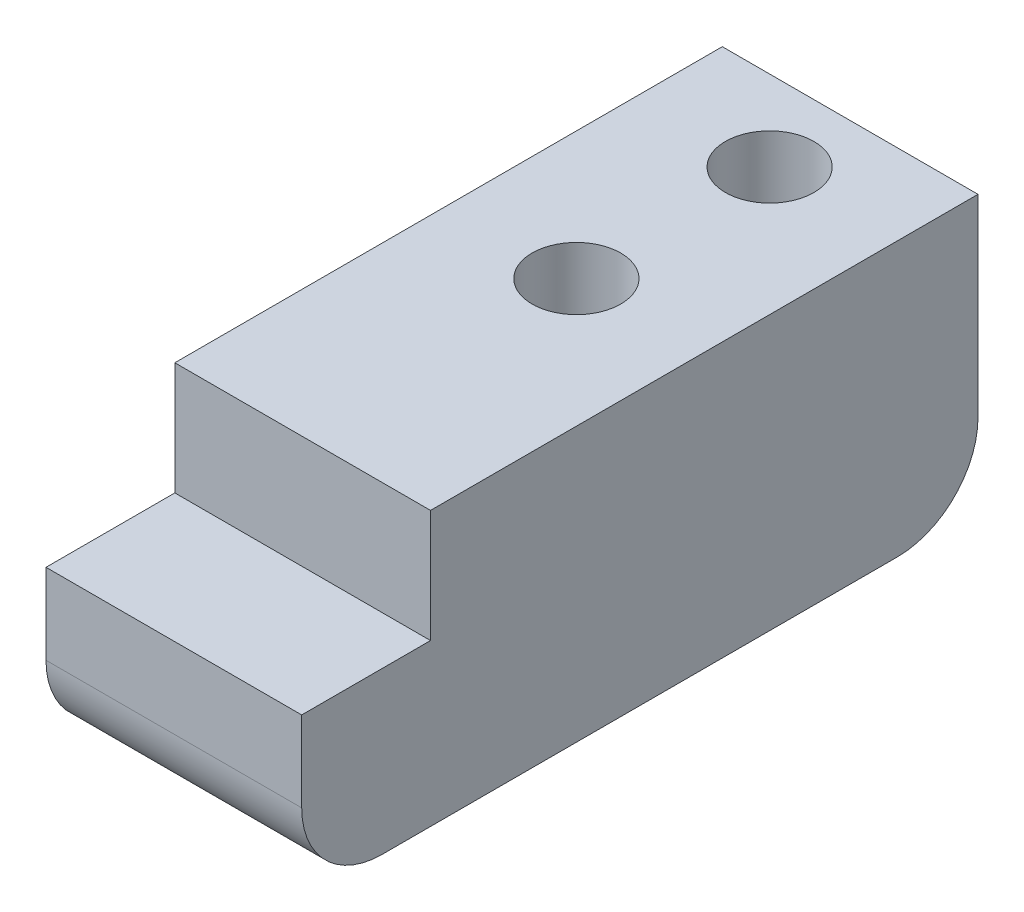
ISO-10303-21;
HEADER;
FILE_DESCRIPTION(('STEP AP214'),'2;1');
FILE_NAME('part.step','',(''),(''),'','','');
FILE_SCHEMA(('AUTOMOTIVE_DESIGN { 1 0 10303 214 1 1 1 1 }'));
ENDSEC;
DATA;
#1=APPLICATION_CONTEXT('core data for automotive mechanical design processes');
#2=APPLICATION_PROTOCOL_DEFINITION('international standard','automotive_design',2000,#1);
#3=PRODUCT_CONTEXT('',#1,'mechanical');
#4=PRODUCT('Part','Part','',(#3));
#5=PRODUCT_RELATED_PRODUCT_CATEGORY('part','',(#4));
#6=PRODUCT_DEFINITION_FORMATION('','',#4);
#7=PRODUCT_DEFINITION_CONTEXT('part definition',#1,'design');
#8=PRODUCT_DEFINITION('design','',#6,#7);
#9=PRODUCT_DEFINITION_SHAPE('','',#8);
#10=(LENGTH_UNIT() NAMED_UNIT(*) SI_UNIT(.MILLI.,.METRE.));
#11=(NAMED_UNIT(*) PLANE_ANGLE_UNIT() SI_UNIT($,.RADIAN.));
#12=(NAMED_UNIT(*) SI_UNIT($,.STERADIAN.) SOLID_ANGLE_UNIT());
#13=UNCERTAINTY_MEASURE_WITH_UNIT(LENGTH_MEASURE(1.E-05),#10,'distance_accuracy_value','');
#14=(GEOMETRIC_REPRESENTATION_CONTEXT(3) GLOBAL_UNCERTAINTY_ASSIGNED_CONTEXT((#13)) GLOBAL_UNIT_ASSIGNED_CONTEXT((#10,
#11,#12)) REPRESENTATION_CONTEXT('',''));
#15=CARTESIAN_POINT('',(0.,0.,0.));
#16=DIRECTION('',(0.,0.,1.));
#17=DIRECTION('',(1.,0.,0.));
#18=AXIS2_PLACEMENT_3D('',#15,#16,#17);
#19=CARTESIAN_POINT('',(7.94,-8.5,17.));
#20=DIRECTION('',(0.,1.,0.));
#21=DIRECTION('',(0.,0.,1.));
#22=AXIS2_PLACEMENT_3D('',#19,#20,#21);
#23=PLANE('',#22);
#24=CARTESIAN_POINT('',(0.,-8.5,0.));
#25=DIRECTION('',(0.,-1.,0.));
#26=DIRECTION('',(0.,0.,-1.));
#27=AXIS2_PLACEMENT_3D('',#24,#25,#26);
#28=CIRCLE('',#27,5.6);
#29=CARTESIAN_POINT('',(0.,-8.5,-5.6));
#30=VERTEX_POINT('',#29);
#31=EDGE_CURVE('E223',#30,#30,#28,.T.);
#32=ORIENTED_EDGE('',*,*,#31,.F.);
#33=EDGE_LOOP('',(#32));
#34=FACE_BOUND('',#33,.T.);
#35=CARTESIAN_POINT('',(0.,-8.5,-12.));
#36=DIRECTION('',(0.,-1.,0.));
#37=DIRECTION('',(0.,0.,-1.));
#38=AXIS2_PLACEMENT_3D('',#35,#36,#37);
#39=CIRCLE('',#38,5.6);
#40=CARTESIAN_POINT('',(5.6,-8.5,-12.));
#41=VERTEX_POINT('',#40);
#42=CARTESIAN_POINT('',(-5.6,-8.5,-12.));
#43=VERTEX_POINT('',#42);
#44=EDGE_CURVE('E113',#41,#43,#39,.T.);
#45=ORIENTED_EDGE('',*,*,#44,.F.);
#46=DIRECTION('',(-1.,0.,0.));
#47=VECTOR('',#46,1.);
#48=CARTESIAN_POINT('',(7.94,-8.5,-12.));
#49=LINE('',#48,#47);
#50=CARTESIAN_POINT('',(7.94,-8.49999999999998,-12.));
#51=VERTEX_POINT('',#50);
#52=EDGE_CURVE('E262',#41,#51,#49,.F.);
#53=ORIENTED_EDGE('',*,*,#52,.T.);
#54=DIRECTION('',(0.,0.,-1.));
#55=VECTOR('',#54,1.);
#56=CARTESIAN_POINT('',(7.94,-8.5,17.));
#57=LINE('',#56,#55);
#58=CARTESIAN_POINT('',(7.94,-8.5,20.));
#59=VERTEX_POINT('',#58);
#60=EDGE_CURVE('E238',#59,#51,#57,.T.);
#61=ORIENTED_EDGE('',*,*,#60,.F.);
#62=DIRECTION('',(-1.,0.,0.));
#63=VECTOR('',#62,1.);
#64=CARTESIAN_POINT('',(7.94,-8.5,20.));
#65=LINE('',#64,#63);
#66=CARTESIAN_POINT('',(-7.94,-8.5,20.));
#67=VERTEX_POINT('',#66);
#68=EDGE_CURVE('E202',#59,#67,#65,.T.);
#69=ORIENTED_EDGE('',*,*,#68,.T.);
#70=DIRECTION('',(0.,0.,-1.));
#71=VECTOR('',#70,1.);
#72=CARTESIAN_POINT('',(-7.94,-8.5,17.));
#73=LINE('',#72,#71);
#74=CARTESIAN_POINT('',(-7.94,-8.5,-12.));
#75=VERTEX_POINT('',#74);
#76=EDGE_CURVE('E230',#67,#75,#73,.T.);
#77=ORIENTED_EDGE('',*,*,#76,.T.);
#78=EDGE_CURVE('E263',#75,#43,#49,.F.);
#79=ORIENTED_EDGE('',*,*,#78,.T.);
#80=EDGE_LOOP('',(#45,#53,#61,#69,#77,#79));
#81=FACE_BOUND('',#80,.T.);
#82=ADVANCED_FACE('F34',(#34,#81),#23,.F.);
#83=CARTESIAN_POINT('',(7.94,-8.5,-17.));
#84=DIRECTION('',(0.,0.,1.));
#85=DIRECTION('',(1.,0.,0.));
#86=AXIS2_PLACEMENT_3D('',#83,#84,#85);
#87=PLANE('',#86);
#88=DIRECTION('',(0.,1.,0.));
#89=VECTOR('',#88,1.);
#90=CARTESIAN_POINT('',(7.94,-8.5,-17.));
#91=LINE('',#90,#89);
#92=CARTESIAN_POINT('',(7.94,-3.5,-17.));
#93=VERTEX_POINT('',#92);
#94=CARTESIAN_POINT('',(7.94,8.5,-17.));
#95=VERTEX_POINT('',#94);
#96=EDGE_CURVE('E227',#93,#95,#91,.T.);
#97=ORIENTED_EDGE('',*,*,#96,.F.);
#98=DIRECTION('',(-1.,0.,0.));
#99=VECTOR('',#98,1.);
#100=CARTESIAN_POINT('',(7.94,-3.5,-17.));
#101=LINE('',#100,#99);
#102=CARTESIAN_POINT('',(-7.94,-3.5,-17.));
#103=VERTEX_POINT('',#102);
#104=EDGE_CURVE('E127',#93,#103,#101,.T.);
#105=ORIENTED_EDGE('',*,*,#104,.T.);
#106=DIRECTION('',(0.,1.,0.));
#107=VECTOR('',#106,1.);
#108=CARTESIAN_POINT('',(-7.94,-8.5,-17.));
#109=LINE('',#108,#107);
#110=CARTESIAN_POINT('',(-7.94,8.5,-17.));
#111=VERTEX_POINT('',#110);
#112=EDGE_CURVE('E212',#103,#111,#109,.T.);
#113=ORIENTED_EDGE('',*,*,#112,.T.);
#114=DIRECTION('',(-1.,0.,0.));
#115=VECTOR('',#114,1.);
#116=CARTESIAN_POINT('',(7.94,8.5,-17.));
#117=LINE('',#116,#115);
#118=EDGE_CURVE('E259',#95,#111,#117,.T.);
#119=ORIENTED_EDGE('',*,*,#118,.F.);
#120=EDGE_LOOP('',(#97,#105,#113,#119));
#121=FACE_BOUND('',#120,.T.);
#122=ADVANCED_FACE('F172',(#121),#87,.F.);
#123=CARTESIAN_POINT('',(7.94,8.5,17.));
#124=DIRECTION('',(0.,-1.,0.));
#125=DIRECTION('',(0.,0.,-1.));
#126=AXIS2_PLACEMENT_3D('',#123,#124,#125);
#127=PLANE('',#126);
#128=CARTESIAN_POINT('',(0.,8.5,-12.));
#129=DIRECTION('',(0.,-1.,0.));
#130=DIRECTION('',(0.,0.,-1.));
#131=AXIS2_PLACEMENT_3D('',#128,#129,#130);
#132=CIRCLE('',#131,2.75);
#133=CARTESIAN_POINT('',(0.,8.5,-14.75));
#134=VERTEX_POINT('',#133);
#135=EDGE_CURVE('E39',#134,#134,#132,.T.);
#136=ORIENTED_EDGE('',*,*,#135,.T.);
#137=EDGE_LOOP('',(#136));
#138=FACE_BOUND('',#137,.T.);
#139=CARTESIAN_POINT('',(0.,8.5,0.));
#140=DIRECTION('',(0.,-1.,0.));
#141=DIRECTION('',(0.,0.,-1.));
#142=AXIS2_PLACEMENT_3D('',#139,#140,#141);
#143=CIRCLE('',#142,2.75);
#144=CARTESIAN_POINT('',(0.,8.5,-2.74999999999999));
#145=VERTEX_POINT('',#144);
#146=EDGE_CURVE('E210',#145,#145,#143,.T.);
#147=ORIENTED_EDGE('',*,*,#146,.T.);
#148=EDGE_LOOP('',(#147));
#149=FACE_BOUND('',#148,.T.);
#150=DIRECTION('',(0.,0.,1.));
#151=VECTOR('',#150,1.);
#152=CARTESIAN_POINT('',(-7.94,8.5,17.));
#153=LINE('',#152,#151);
#154=CARTESIAN_POINT('',(-7.94,8.5,17.));
#155=VERTEX_POINT('',#154);
#156=EDGE_CURVE('E216',#111,#155,#153,.T.);
#157=ORIENTED_EDGE('',*,*,#156,.T.);
#158=DIRECTION('',(-1.,0.,0.));
#159=VECTOR('',#158,1.);
#160=CARTESIAN_POINT('',(7.94,8.5,17.));
#161=LINE('',#160,#159);
#162=CARTESIAN_POINT('',(7.94,8.5,17.));
#163=VERTEX_POINT('',#162);
#164=EDGE_CURVE('E256',#163,#155,#161,.T.);
#165=ORIENTED_EDGE('',*,*,#164,.F.);
#166=DIRECTION('',(0.,0.,1.));
#167=VECTOR('',#166,1.);
#168=CARTESIAN_POINT('',(7.94,8.5,17.));
#169=LINE('',#168,#167);
#170=EDGE_CURVE('E229',#95,#163,#169,.T.);
#171=ORIENTED_EDGE('',*,*,#170,.F.);
#172=ORIENTED_EDGE('',*,*,#118,.T.);
#173=EDGE_LOOP('',(#157,#165,#171,#172));
#174=FACE_BOUND('',#173,.T.);
#175=ADVANCED_FACE('F184',(#138,#149,#174),#127,.F.);
#176=CARTESIAN_POINT('',(7.94,1.49999999999998,17.));
#177=DIRECTION('',(0.,0.,-1.));
#178=DIRECTION('',(-1.,0.,0.));
#179=AXIS2_PLACEMENT_3D('',#176,#177,#178);
#180=PLANE('',#179);
#181=DIRECTION('',(0.,-1.,0.));
#182=VECTOR('',#181,1.);
#183=CARTESIAN_POINT('',(-7.94,1.49999999999998,17.));
#184=LINE('',#183,#182);
#185=CARTESIAN_POINT('',(-7.94,1.49999999999998,17.));
#186=VERTEX_POINT('',#185);
#187=EDGE_CURVE('E242',#155,#186,#184,.T.);
#188=ORIENTED_EDGE('',*,*,#187,.T.);
#189=DIRECTION('',(-1.,0.,0.));
#190=VECTOR('',#189,1.);
#191=CARTESIAN_POINT('',(7.94,1.49999999999998,17.));
#192=LINE('',#191,#190);
#193=CARTESIAN_POINT('',(7.94,1.49999999999998,17.));
#194=VERTEX_POINT('',#193);
#195=EDGE_CURVE('E253',#194,#186,#192,.T.);
#196=ORIENTED_EDGE('',*,*,#195,.F.);
#197=DIRECTION('',(0.,-1.,0.));
#198=VECTOR('',#197,1.);
#199=CARTESIAN_POINT('',(7.94,1.49999999999998,17.));
#200=LINE('',#199,#198);
#201=EDGE_CURVE('E232',#163,#194,#200,.T.);
#202=ORIENTED_EDGE('',*,*,#201,.F.);
#203=ORIENTED_EDGE('',*,*,#164,.T.);
#204=EDGE_LOOP('',(#188,#196,#202,#203));
#205=FACE_BOUND('',#204,.T.);
#206=ADVANCED_FACE('F180',(#205),#180,.F.);
#207=CARTESIAN_POINT('',(7.94,1.49999999999998,17.));
#208=DIRECTION('',(0.,-1.,0.));
#209=DIRECTION('',(0.,0.,-1.));
#210=AXIS2_PLACEMENT_3D('',#207,#208,#209);
#211=PLANE('',#210);
#212=DIRECTION('',(0.,0.,1.));
#213=VECTOR('',#212,1.);
#214=CARTESIAN_POINT('',(-7.94,1.49999999999998,17.));
#215=LINE('',#214,#213);
#216=CARTESIAN_POINT('',(-7.94,1.49999999999998,25.));
#217=VERTEX_POINT('',#216);
#218=EDGE_CURVE('E244',#186,#217,#215,.T.);
#219=ORIENTED_EDGE('',*,*,#218,.T.);
#220=DIRECTION('',(-1.,0.,0.));
#221=VECTOR('',#220,1.);
#222=CARTESIAN_POINT('',(7.94,1.49999999999998,25.));
#223=LINE('',#222,#221);
#224=CARTESIAN_POINT('',(7.94,1.49999999999998,25.));
#225=VERTEX_POINT('',#224);
#226=EDGE_CURVE('E239',#225,#217,#223,.T.);
#227=ORIENTED_EDGE('',*,*,#226,.F.);
#228=DIRECTION('',(0.,0.,1.));
#229=VECTOR('',#228,1.);
#230=CARTESIAN_POINT('',(7.94,1.49999999999998,17.));
#231=LINE('',#230,#229);
#232=EDGE_CURVE('E234',#194,#225,#231,.T.);
#233=ORIENTED_EDGE('',*,*,#232,.F.);
#234=ORIENTED_EDGE('',*,*,#195,.T.);
#235=EDGE_LOOP('',(#219,#227,#233,#234));
#236=FACE_BOUND('',#235,.T.);
#237=ADVANCED_FACE('F176',(#236),#211,.F.);
#238=CARTESIAN_POINT('',(7.94,-8.50000000000001,25.));
#239=DIRECTION('',(0.,0.,-1.));
#240=DIRECTION('',(-1.,0.,0.));
#241=AXIS2_PLACEMENT_3D('',#238,#239,#240);
#242=PLANE('',#241);
#243=DIRECTION('',(0.,-1.,0.));
#244=VECTOR('',#243,1.);
#245=CARTESIAN_POINT('',(-7.94,-8.50000000000001,25.));
#246=LINE('',#245,#244);
#247=CARTESIAN_POINT('',(-7.94,-3.5,25.));
#248=VERTEX_POINT('',#247);
#249=EDGE_CURVE('E246',#217,#248,#246,.T.);
#250=ORIENTED_EDGE('',*,*,#249,.T.);
#251=DIRECTION('',(-1.,0.,0.));
#252=VECTOR('',#251,1.);
#253=CARTESIAN_POINT('',(7.94,-3.5,25.));
#254=LINE('',#253,#252);
#255=CARTESIAN_POINT('',(7.94,-3.5,25.));
#256=VERTEX_POINT('',#255);
#257=EDGE_CURVE('E200',#248,#256,#254,.F.);
#258=ORIENTED_EDGE('',*,*,#257,.T.);
#259=DIRECTION('',(0.,-1.,0.));
#260=VECTOR('',#259,1.);
#261=CARTESIAN_POINT('',(7.94,-8.50000000000001,25.));
#262=LINE('',#261,#260);
#263=EDGE_CURVE('E236',#225,#256,#262,.T.);
#264=ORIENTED_EDGE('',*,*,#263,.F.);
#265=ORIENTED_EDGE('',*,*,#226,.T.);
#266=EDGE_LOOP('',(#250,#258,#264,#265));
#267=FACE_BOUND('',#266,.T.);
#268=ADVANCED_FACE('F165',(#267),#242,.F.);
#269=CARTESIAN_POINT('',(7.94,0.,0.));
#270=DIRECTION('',(-1.,0.,0.));
#271=DIRECTION('',(0.,0.,1.));
#272=AXIS2_PLACEMENT_3D('',#269,#270,#271);
#273=PLANE('',#272);
#274=ORIENTED_EDGE('',*,*,#263,.T.);
#275=CARTESIAN_POINT('',(7.94,-3.5,20.));
#276=DIRECTION('',(-1.,0.,0.));
#277=DIRECTION('',(0.,0.,1.));
#278=AXIS2_PLACEMENT_3D('',#275,#276,#277);
#279=CIRCLE('',#278,5.);
#280=EDGE_CURVE('E199',#256,#59,#279,.F.);
#281=ORIENTED_EDGE('',*,*,#280,.T.);
#282=ORIENTED_EDGE('',*,*,#60,.T.);
#283=CARTESIAN_POINT('',(7.94,-3.5,-12.));
#284=DIRECTION('',(-1.,0.,0.));
#285=DIRECTION('',(0.,0.,1.));
#286=AXIS2_PLACEMENT_3D('',#283,#284,#285);
#287=CIRCLE('',#286,5.);
#288=EDGE_CURVE('E58',#51,#93,#287,.F.);
#289=ORIENTED_EDGE('',*,*,#288,.T.);
#290=ORIENTED_EDGE('',*,*,#96,.T.);
#291=ORIENTED_EDGE('',*,*,#170,.T.);
#292=ORIENTED_EDGE('',*,*,#201,.T.);
#293=ORIENTED_EDGE('',*,*,#232,.T.);
#294=EDGE_LOOP('',(#274,#281,#282,#289,#290,#291,#292,#293));
#295=FACE_BOUND('',#294,.T.);
#296=ADVANCED_FACE('F161',(#295),#273,.F.);
#297=CARTESIAN_POINT('',(-7.94,0.,0.));
#298=DIRECTION('',(-1.,0.,0.));
#299=DIRECTION('',(0.,0.,1.));
#300=AXIS2_PLACEMENT_3D('',#297,#298,#299);
#301=PLANE('',#300);
#302=ORIENTED_EDGE('',*,*,#76,.F.);
#303=CARTESIAN_POINT('',(-7.94,-3.5,20.));
#304=DIRECTION('',(-1.,0.,0.));
#305=DIRECTION('',(0.,0.,1.));
#306=AXIS2_PLACEMENT_3D('',#303,#304,#305);
#307=CIRCLE('',#306,5.);
#308=EDGE_CURVE('E268',#67,#248,#307,.T.);
#309=ORIENTED_EDGE('',*,*,#308,.T.);
#310=ORIENTED_EDGE('',*,*,#249,.F.);
#311=ORIENTED_EDGE('',*,*,#218,.F.);
#312=ORIENTED_EDGE('',*,*,#187,.F.);
#313=ORIENTED_EDGE('',*,*,#156,.F.);
#314=ORIENTED_EDGE('',*,*,#112,.F.);
#315=CARTESIAN_POINT('',(-7.94,-3.5,-12.));
#316=DIRECTION('',(-1.,0.,0.));
#317=DIRECTION('',(0.,0.,1.));
#318=AXIS2_PLACEMENT_3D('',#315,#316,#317);
#319=CIRCLE('',#318,5.);
#320=EDGE_CURVE('E266',#103,#75,#319,.T.);
#321=ORIENTED_EDGE('',*,*,#320,.T.);
#322=EDGE_LOOP('',(#302,#309,#310,#311,#312,#313,#314,#321));
#323=FACE_BOUND('',#322,.T.);
#324=ADVANCED_FACE('F164',(#323),#301,.T.);
#325=CARTESIAN_POINT('',(7.94,-3.5,20.));
#326=DIRECTION('',(-1.,0.,0.));
#327=DIRECTION('',(0.,0.,1.));
#328=AXIS2_PLACEMENT_3D('',#325,#326,#327);
#329=CYLINDRICAL_SURFACE('',#328,5.);
#330=ORIENTED_EDGE('',*,*,#280,.F.);
#331=ORIENTED_EDGE('',*,*,#257,.F.);
#332=ORIENTED_EDGE('',*,*,#308,.F.);
#333=ORIENTED_EDGE('',*,*,#68,.F.);
#334=EDGE_LOOP('',(#330,#331,#332,#333));
#335=FACE_BOUND('',#334,.T.);
#336=ADVANCED_FACE('F168',(#335),#329,.T.);
#337=CARTESIAN_POINT('',(7.94,-3.5,-12.));
#338=DIRECTION('',(-1.,0.,0.));
#339=DIRECTION('',(0.,0.,1.));
#340=AXIS2_PLACEMENT_3D('',#337,#338,#339);
#341=CYLINDRICAL_SURFACE('',#340,5.);
#342=CARTESIAN_POINT('',(-5.6,-8.5,-12.));
#343=CARTESIAN_POINT('',(-5.60002727548701,-8.50002651621474,-12.1150040209938));
#344=CARTESIAN_POINT('',(-5.59645843404109,-8.49603332638634,-12.2299899917553));
#345=CARTESIAN_POINT('',(-5.58233303320452,-8.48020738131622,-12.4589377345914));
#346=CARTESIAN_POINT('',(-5.57177974802086,-8.46837829942589,-12.5728999612223));
#347=CARTESIAN_POINT('',(-5.54421390419849,-8.43744398042495,-12.7962936382068));
#348=CARTESIAN_POINT('',(-5.52735725764991,-8.41851434124379,-12.9057688221641));
#349=CARTESIAN_POINT('',(-5.48752755756419,-8.37371152891829,-13.1221149287623));
#350=CARTESIAN_POINT('',(-5.4645553489682,-8.3478393149733,-13.2289862089402));
#351=CARTESIAN_POINT('',(-5.40268694613735,-8.27801052402638,-13.4811546778108));
#352=CARTESIAN_POINT('',(-5.36108524284405,-8.2309475755351,-13.6249508293622));
#353=CARTESIAN_POINT('',(-5.29099289848139,-8.15131882407296,-13.8360380438285));
#354=CARTESIAN_POINT('',(-5.26610424632165,-8.12299249912757,-13.9062029287663));
#355=CARTESIAN_POINT('',(-5.21399918332695,-8.0635502617243,-14.0444213396276));
#356=CARTESIAN_POINT('',(-5.18678368529337,-8.03243544293942,-14.1124756793518));
#357=CARTESIAN_POINT('',(-5.15848815061157,-8.,-14.1794494717703));
#358=B_SPLINE_CURVE_WITH_KNOTS('',3,(#342,#343,#344,#345,#346,#347,#348,#349,#350,#351,#352,
#353,#354,#355,#356,#357),.UNSPECIFIED.,.F.,.F.,(4,2,2,2,2,2,2,4),(0.,0.344858646129342,
0.689555741876149,1.02623717835761,1.36287212222054,1.83251210442697,2.07138728582141,
2.31016918479319),.UNSPECIFIED.);
#359=CARTESIAN_POINT('',(-5.15848815061157,-8.,-14.1794494717703));
#360=VERTEX_POINT('',#359);
#361=EDGE_CURVE('E11',#43,#360,#358,.T.);
#362=ORIENTED_EDGE('',*,*,#361,.F.);
#363=ORIENTED_EDGE('',*,*,#78,.F.);
#364=ORIENTED_EDGE('',*,*,#320,.F.);
#365=ORIENTED_EDGE('',*,*,#104,.F.);
#366=ORIENTED_EDGE('',*,*,#288,.F.);
#367=ORIENTED_EDGE('',*,*,#52,.F.);
#368=CARTESIAN_POINT('',(5.15848815061157,-8.,-14.1794494717703));
#369=CARTESIAN_POINT('',(5.19940571493848,-8.04690175551763,-14.0826298119704));
#370=CARTESIAN_POINT('',(5.23807131969705,-8.09105327807003,-13.983481587604));
#371=CARTESIAN_POINT('',(5.31038277139763,-8.17338862247827,-13.7808398976933));
#372=CARTESIAN_POINT('',(5.34402336434596,-8.21156620012163,-13.677342027134));
#373=CARTESIAN_POINT('',(5.40493309535605,-8.28053921596053,-13.469075319808));
#374=CARTESIAN_POINT('',(5.43233710778142,-8.31149139450388,-13.3643983655526));
#375=CARTESIAN_POINT('',(5.48130362100224,-8.36670853921818,-13.1520368183281));
#376=CARTESIAN_POINT('',(5.5028693787991,-8.39097723405164,-13.0443539394244));
#377=CARTESIAN_POINT('',(5.54695784867303,-8.44053829509041,-12.7840711039783));
#378=CARTESIAN_POINT('',(5.56658147579918,-8.46254749011489,-12.6303127196068));
#379=CARTESIAN_POINT('',(5.58650091875676,-8.48487736062236,-12.3965950704192));
#380=CARTESIAN_POINT('',(5.59155581824359,-8.4905411163758,-12.3174860980525));
#381=CARTESIAN_POINT('',(5.59830704786147,-8.49810398501922,-12.1589265788908));
#382=CARTESIAN_POINT('',(5.60000256190032,-8.50000218314612,-12.079475953795));
#383=CARTESIAN_POINT('',(5.6,-8.5,-12.));
#384=B_SPLINE_CURVE_WITH_KNOTS('',3,(#368,#369,#370,#371,#372,#373,#374,#375,#376,#377,#378,
#379,#380,#381,#382,#383),.UNSPECIFIED.,.F.,.F.,(4,2,2,2,2,2,2,4),(0.,0.345278454071739,
0.690915430736247,1.02815981725952,1.36521567490581,1.83355632379953,2.07183597863433,
2.31017351141731),.UNSPECIFIED.);
#385=CARTESIAN_POINT('',(5.15848815061157,-8.,-14.1794494717703));
#386=VERTEX_POINT('',#385);
#387=EDGE_CURVE('E125',#386,#41,#384,.T.);
#388=ORIENTED_EDGE('',*,*,#387,.F.);
#389=CARTESIAN_POINT('',(-5.70383363011033,-8.28519999999895,-13.4497796246361));
#390=CARTESIAN_POINT('',(-5.64434762240624,-8.25340280701981,-13.5546902335442));
#391=CARTESIAN_POINT('',(-5.57968733684662,-8.21905062232566,-13.6556848436836));
#392=CARTESIAN_POINT('',(-5.44177192886549,-8.14642988155327,-13.8497074173035));
#393=CARTESIAN_POINT('',(-5.36854005897583,-8.10817195524884,-13.9427558015687));
#394=CARTESIAN_POINT('',(-5.21574546510294,-8.02918853816166,-14.1203273140693));
#395=CARTESIAN_POINT('',(-5.13626098550696,-7.98849471310904,-14.2049327522382));
#396=CARTESIAN_POINT('',(-4.97133614368533,-7.90509122298294,-14.367170615463));
#397=CARTESIAN_POINT('',(-4.88589070212712,-7.862379849014,-14.4447969615058));
#398=CARTESIAN_POINT('',(-4.67083128921156,-7.75642005916763,-14.6264712746359));
#399=CARTESIAN_POINT('',(-4.53848819956437,-7.69249361862156,-14.7268974869843));
#400=CARTESIAN_POINT('',(-4.26534983079924,-7.56398980370661,-14.9149534062869));
#401=CARTESIAN_POINT('',(-4.12455266895349,-7.49941228702695,-15.0025802477859));
#402=CARTESIAN_POINT('',(-3.83482624985378,-7.37086396563106,-15.1665973435858));
#403=CARTESIAN_POINT('',(-3.68584706438028,-7.30690054834009,-15.2429048449795));
#404=CARTESIAN_POINT('',(-3.38160189356225,-7.18172084212289,-15.3843532362474));
#405=CARTESIAN_POINT('',(-3.2263362894241,-7.12050438709495,-15.4494948019702));
#406=CARTESIAN_POINT('',(-2.90281479852069,-6.99978922275801,-15.5720031759124));
#407=CARTESIAN_POINT('',(-2.73429037395823,-6.94050165003565,-15.6288696670996));
#408=CARTESIAN_POINT('',(-2.39161883838529,-6.82889938383126,-15.7315114135164));
#409=CARTESIAN_POINT('',(-2.21747132122738,-6.77658519543198,-15.777285865545));
#410=CARTESIAN_POINT('',(-1.86488202169892,-6.68137776618328,-15.8578116727169));
#411=CARTESIAN_POINT('',(-1.68646021497982,-6.63844765921332,-15.8926064107715));
#412=CARTESIAN_POINT('',(-1.3255068651989,-6.56401581803832,-15.9514643954005));
#413=CARTESIAN_POINT('',(-1.1429762818676,-6.53251144382785,-15.9755301212927));
#414=CARTESIAN_POINT('',(-0.797256999671608,-6.48591635525433,-16.0106167198456));
#415=CARTESIAN_POINT('',(-0.634398583552467,-6.46930147400257,-16.0228631555612));
#416=CARTESIAN_POINT('',(-0.307509913535211,-6.44736410294124,-16.0389647063026));
#417=CARTESIAN_POINT('',(-0.143479783433762,-6.44204043736662,-16.0428206950348));
#418=CARTESIAN_POINT('',(0.184485415258509,-6.44300363771372,-16.0421193934717));
#419=CARTESIAN_POINT('',(0.34842049736506,-6.44928759934239,-16.0375642076992));
#420=CARTESIAN_POINT('',(0.675021358521114,-6.47308497904559,-16.0200721126636));
#421=CARTESIAN_POINT('',(0.837687050182877,-6.4905991634507,-16.0071346314066));
#422=CARTESIAN_POINT('',(1.1595621828955,-6.53572540079925,-15.9730541114488));
#423=CARTESIAN_POINT('',(1.31878772763804,-6.5632669439504,-15.9519683075741));
#424=CARTESIAN_POINT('',(1.63420750894391,-6.62714391057071,-15.9016177177409));
#425=CARTESIAN_POINT('',(1.79040030627166,-6.66348340413474,-15.8723491453093));
#426=CARTESIAN_POINT('',(2.09966205979235,-6.74359941342961,-15.8054949390096));
#427=CARTESIAN_POINT('',(2.25271777087718,-6.78740218928245,-15.7678797907134));
#428=CARTESIAN_POINT('',(2.55464656455981,-6.88082643312166,-15.6842827843457));
#429=CARTESIAN_POINT('',(2.7035207777569,-6.93044630912842,-15.6383032134938));
#430=CARTESIAN_POINT('',(3.02268536438918,-7.04324335634945,-15.5288312321129));
#431=CARTESIAN_POINT('',(3.19211064603121,-7.10726669250683,-15.4636798756598));
#432=CARTESIAN_POINT('',(3.52403814838066,-7.2392312397665,-15.3207853312567));
#433=CARTESIAN_POINT('',(3.68653893970437,-7.30717325303226,-15.2430395592635));
#434=CARTESIAN_POINT('',(4.00255965128781,-7.44444344737814,-15.0745896581958));
#435=CARTESIAN_POINT('',(4.15613067827541,-7.51375988064781,-14.9839722244121));
#436=CARTESIAN_POINT('',(4.45392181492881,-7.65211848934376,-14.7882396960274));
#437=CARTESIAN_POINT('',(4.59814462803014,-7.72116073859114,-14.6831288205717));
#438=CARTESIAN_POINT('',(4.83074734796616,-7.83500263661194,-14.4931485128837));
#439=CARTESIAN_POINT('',(4.92225756862896,-7.88050586120754,-14.4125277138695));
#440=CARTESIAN_POINT('',(5.09879568011334,-7.96940640503388,-14.2435492711769));
#441=CARTESIAN_POINT('',(5.18382978240529,-8.01280572728691,-14.1551992202536));
#442=CARTESIAN_POINT('',(5.34712013439182,-8.09701566697927,-13.9692589849718));
#443=CARTESIAN_POINT('',(5.42529122673949,-8.13779242956922,-13.8715775866226));
#444=CARTESIAN_POINT('',(5.57219661391371,-8.21507174245049,-13.6673391504531));
#445=CARTESIAN_POINT('',(5.64090174003953,-8.25156103251007,-13.560756235371));
#446=CARTESIAN_POINT('',(5.70383363011078,-8.28519999999921,-13.4497796246368));
#447=B_SPLINE_CURVE_WITH_KNOTS('',3,(#389,#390,#391,#392,#393,#394,#395,#396,#397,#398,#399,
#400,#401,#402,#403,#404,#405,#406,#407,#408,#409,#410,#411,#412,#413,#414,#415,#416,#417,#418,
#419,#420,#421,#422,#423,#424,#425,#426,#427,#428,#429,#430,#431,#432,#433,#434,#435,#436,#437,
#438,#439,#440,#441,#442,#443,#444,#445,#446),.UNSPECIFIED.,.F.,.F.,(4,2,2,2,2,2,2,2,2,2,2,2,2,
2,2,2,2,2,2,2,2,2,2,2,2,2,2,2,4),(0.,0.373723011285275,0.746454730935325,1.11509842283736,
1.48406016576652,2.01727402076447,2.55060706648534,3.08766501604407,3.6246904472167,
4.18660747094694,4.74856517227933,5.30827383444936,5.86785308901242,6.35976337774608,
6.85162244087734,7.3433584547983,7.83512802748891,8.32350435925815,8.81210705613947,
9.30246584937191,9.79269075685402,10.3695548106185,10.9465373719832,11.5198033772838,
12.0929028516605,12.4830677784235,12.872853644154,13.2669412039063,13.6622171827928),.UNSPECIFIED.);
#448=EDGE_CURVE('E44',#360,#386,#447,.T.);
#449=ORIENTED_EDGE('',*,*,#448,.F.);
#450=EDGE_LOOP('',(#362,#363,#364,#365,#366,#367,#388,#449));
#451=FACE_BOUND('',#450,.T.);
#452=ADVANCED_FACE('F36',(#451),#341,.T.);
#453=CARTESIAN_POINT('',(0.,-8.5,0.));
#454=DIRECTION('',(0.,-1.,0.));
#455=DIRECTION('',(0.,0.,-1.));
#456=AXIS2_PLACEMENT_3D('',#453,#454,#455);
#457=CYLINDRICAL_SURFACE('',#456,2.75);
#458=CARTESIAN_POINT('',(0.,-5.15,0.));
#459=DIRECTION('',(0.,-1.,0.));
#460=DIRECTION('',(0.,0.,-1.));
#461=AXIS2_PLACEMENT_3D('',#458,#459,#460);
#462=CIRCLE('',#461,2.75);
#463=CARTESIAN_POINT('',(0.,-5.15,-2.75));
#464=VERTEX_POINT('',#463);
#465=EDGE_CURVE('E213',#464,#464,#462,.T.);
#466=ORIENTED_EDGE('',*,*,#465,.T.);
#467=EDGE_LOOP('',(#466));
#468=FACE_BOUND('',#467,.T.);
#469=ORIENTED_EDGE('',*,*,#146,.F.);
#470=EDGE_LOOP('',(#469));
#471=FACE_BOUND('',#470,.T.);
#472=ADVANCED_FACE('F156',(#468,#471),#457,.F.);
#473=CARTESIAN_POINT('',(0.,-8.,0.));
#474=DIRECTION('',(0.,-1.,0.));
#475=DIRECTION('',(0.,0.,-1.));
#476=AXIS2_PLACEMENT_3D('',#473,#474,#475);
#477=CONICAL_SURFACE('',#476,5.6,0.785398163397449);
#478=ORIENTED_EDGE('',*,*,#465,.F.);
#479=EDGE_LOOP('',(#478));
#480=FACE_BOUND('',#479,.T.);
#481=CARTESIAN_POINT('',(0.,-8.,0.));
#482=DIRECTION('',(0.,-1.,0.));
#483=DIRECTION('',(0.,0.,-1.));
#484=AXIS2_PLACEMENT_3D('',#481,#482,#483);
#485=CIRCLE('',#484,5.6);
#486=CARTESIAN_POINT('',(0.,-8.,-5.6));
#487=VERTEX_POINT('',#486);
#488=EDGE_CURVE('E219',#487,#487,#485,.T.);
#489=ORIENTED_EDGE('',*,*,#488,.T.);
#490=EDGE_LOOP('',(#489));
#491=FACE_BOUND('',#490,.T.);
#492=ADVANCED_FACE('F152',(#480,#491),#477,.F.);
#493=CARTESIAN_POINT('',(0.,-8.5,0.));
#494=DIRECTION('',(0.,-1.,0.));
#495=DIRECTION('',(0.,0.,-1.));
#496=AXIS2_PLACEMENT_3D('',#493,#494,#495);
#497=CYLINDRICAL_SURFACE('',#496,5.6);
#498=ORIENTED_EDGE('',*,*,#488,.F.);
#499=EDGE_LOOP('',(#498));
#500=FACE_BOUND('',#499,.T.);
#501=ORIENTED_EDGE('',*,*,#31,.T.);
#502=EDGE_LOOP('',(#501));
#503=FACE_BOUND('',#502,.T.);
#504=ADVANCED_FACE('F148',(#500,#503),#497,.F.);
#505=CARTESIAN_POINT('',(0.,-8.5,-12.));
#506=DIRECTION('',(0.,-1.,0.));
#507=DIRECTION('',(0.,0.,-1.));
#508=AXIS2_PLACEMENT_3D('',#505,#506,#507);
#509=CYLINDRICAL_SURFACE('',#508,2.75);
#510=CARTESIAN_POINT('',(0.,-5.15,-12.));
#511=DIRECTION('',(0.,-1.,0.));
#512=DIRECTION('',(0.,0.,-1.));
#513=AXIS2_PLACEMENT_3D('',#510,#511,#512);
#514=CIRCLE('',#513,2.75);
#515=CARTESIAN_POINT('',(0.,-5.15,-14.75));
#516=VERTEX_POINT('',#515);
#517=EDGE_CURVE('E122',#516,#516,#514,.T.);
#518=ORIENTED_EDGE('',*,*,#517,.T.);
#519=EDGE_LOOP('',(#518));
#520=FACE_BOUND('',#519,.T.);
#521=ORIENTED_EDGE('',*,*,#135,.F.);
#522=EDGE_LOOP('',(#521));
#523=FACE_BOUND('',#522,.T.);
#524=ADVANCED_FACE('F144',(#520,#523),#509,.F.);
#525=CARTESIAN_POINT('',(0.,-8.,-12.));
#526=DIRECTION('',(0.,-1.,0.));
#527=DIRECTION('',(0.,0.,-1.));
#528=AXIS2_PLACEMENT_3D('',#525,#526,#527);
#529=CONICAL_SURFACE('',#528,5.6,0.785398163397449);
#530=ORIENTED_EDGE('',*,*,#448,.T.);
#531=CARTESIAN_POINT('',(0.,-8.,-12.));
#532=DIRECTION('',(0.,-1.,0.));
#533=DIRECTION('',(0.,0.,-1.));
#534=AXIS2_PLACEMENT_3D('',#531,#532,#533);
#535=CIRCLE('',#534,5.6);
#536=EDGE_CURVE('E50',#386,#360,#535,.T.);
#537=ORIENTED_EDGE('',*,*,#536,.T.);
#538=EDGE_LOOP('',(#530,#537));
#539=FACE_BOUND('',#538,.T.);
#540=ORIENTED_EDGE('',*,*,#517,.F.);
#541=EDGE_LOOP('',(#540));
#542=FACE_BOUND('',#541,.T.);
#543=ADVANCED_FACE('F119',(#539,#542),#529,.F.);
#544=CARTESIAN_POINT('',(0.,-8.5,-12.));
#545=DIRECTION('',(0.,-1.,0.));
#546=DIRECTION('',(0.,0.,-1.));
#547=AXIS2_PLACEMENT_3D('',#544,#545,#546);
#548=CYLINDRICAL_SURFACE('',#547,5.6);
#549=ORIENTED_EDGE('',*,*,#361,.T.);
#550=ORIENTED_EDGE('',*,*,#536,.F.);
#551=ORIENTED_EDGE('',*,*,#387,.T.);
#552=ORIENTED_EDGE('',*,*,#44,.T.);
#553=EDGE_LOOP('',(#549,#550,#551,#552));
#554=FACE_BOUND('',#553,.T.);
#555=ADVANCED_FACE('F111',(#554),#548,.F.);
#556=CLOSED_SHELL('',(#82,#122,#175,#206,#237,#268,#296,#324,#336,#452,#472,#492,#504,#524,#543,#555));
#557=MANIFOLD_SOLID_BREP('B2',#556);
#558=ADVANCED_BREP_SHAPE_REPRESENTATION('',(#18,#557),#14);
#559=SHAPE_DEFINITION_REPRESENTATION(#9,#558);
ENDSEC;
END-ISO-10303-21;
